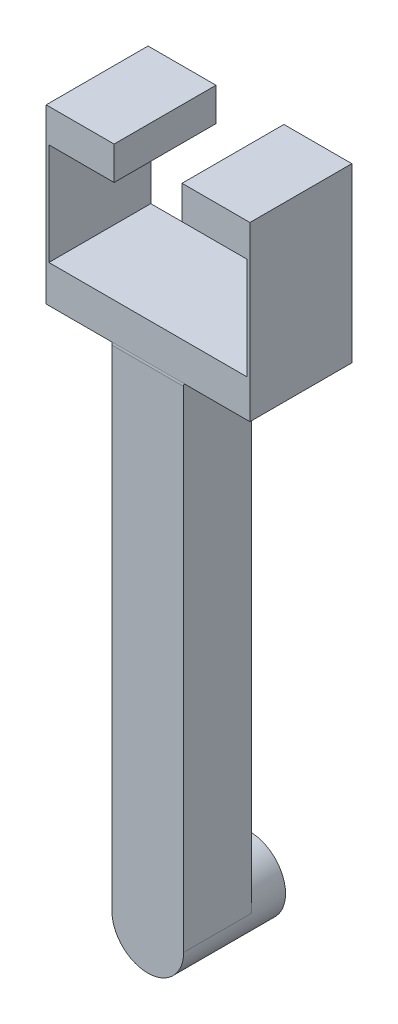
ISO-10303-21;
HEADER;
FILE_DESCRIPTION(('STEP AP214'),'2;1');
FILE_NAME('part.step','',(''),(''),'','','');
FILE_SCHEMA(('AUTOMOTIVE_DESIGN { 1 0 10303 214 1 1 1 1 }'));
ENDSEC;
DATA;
#1=APPLICATION_CONTEXT('core data for automotive mechanical design processes');
#2=APPLICATION_PROTOCOL_DEFINITION('international standard','automotive_design',2000,#1);
#3=PRODUCT_CONTEXT('',#1,'mechanical');
#4=PRODUCT('Part','Part','',(#3));
#5=PRODUCT_RELATED_PRODUCT_CATEGORY('part','',(#4));
#6=PRODUCT_DEFINITION_FORMATION('','',#4);
#7=PRODUCT_DEFINITION_CONTEXT('part definition',#1,'design');
#8=PRODUCT_DEFINITION('design','',#6,#7);
#9=PRODUCT_DEFINITION_SHAPE('','',#8);
#10=(LENGTH_UNIT() NAMED_UNIT(*) SI_UNIT(.MILLI.,.METRE.));
#11=(NAMED_UNIT(*) PLANE_ANGLE_UNIT() SI_UNIT($,.RADIAN.));
#12=(NAMED_UNIT(*) SI_UNIT($,.STERADIAN.) SOLID_ANGLE_UNIT());
#13=UNCERTAINTY_MEASURE_WITH_UNIT(LENGTH_MEASURE(1.E-05),#10,'distance_accuracy_value','');
#14=(GEOMETRIC_REPRESENTATION_CONTEXT(3) GLOBAL_UNCERTAINTY_ASSIGNED_CONTEXT((#13)) GLOBAL_UNIT_ASSIGNED_CONTEXT((#10,
#11,#12)) REPRESENTATION_CONTEXT('',''));
#15=CARTESIAN_POINT('',(0.,0.,0.));
#16=DIRECTION('',(0.,0.,1.));
#17=DIRECTION('',(1.,0.,0.));
#18=AXIS2_PLACEMENT_3D('',#15,#16,#17);
#19=CARTESIAN_POINT('',(0.,0.,38.1));
#20=DIRECTION('',(0.,0.,-1.));
#21=DIRECTION('',(-1.,0.,0.));
#22=AXIS2_PLACEMENT_3D('',#19,#20,#21);
#23=CYLINDRICAL_SURFACE('',#22,13.4112);
#24=CARTESIAN_POINT('',(0.,0.,38.1));
#25=DIRECTION('',(0.,0.,1.));
#26=DIRECTION('',(1.,0.,0.));
#27=AXIS2_PLACEMENT_3D('',#24,#25,#26);
#28=CIRCLE('',#27,13.4112);
#29=CARTESIAN_POINT('',(-13.4112,0.,38.1));
#30=VERTEX_POINT('',#29);
#31=CARTESIAN_POINT('',(13.4112,0.,38.1));
#32=VERTEX_POINT('',#31);
#33=EDGE_CURVE('E353',#30,#32,#28,.T.);
#34=ORIENTED_EDGE('',*,*,#33,.F.);
#35=DIRECTION('',(0.,0.,1.));
#36=VECTOR('',#35,1.);
#37=CARTESIAN_POINT('',(-13.4112,0.,12.7));
#38=LINE('',#37,#36);
#39=CARTESIAN_POINT('',(-13.4112,0.,12.7));
#40=VERTEX_POINT('',#39);
#41=EDGE_CURVE('E334',#40,#30,#38,.T.);
#42=ORIENTED_EDGE('',*,*,#41,.F.);
#43=CARTESIAN_POINT('',(0.,0.,12.7));
#44=DIRECTION('',(0.,0.,-1.));
#45=DIRECTION('',(-1.,0.,0.));
#46=AXIS2_PLACEMENT_3D('',#43,#44,#45);
#47=CIRCLE('',#46,13.4112);
#48=CARTESIAN_POINT('',(13.4112,0.,12.7));
#49=VERTEX_POINT('',#48);
#50=EDGE_CURVE('E356',#40,#49,#47,.T.);
#51=ORIENTED_EDGE('',*,*,#50,.T.);
#52=DIRECTION('',(0.,0.,1.));
#53=VECTOR('',#52,1.);
#54=CARTESIAN_POINT('',(13.4112,0.,12.7));
#55=LINE('',#54,#53);
#56=EDGE_CURVE('E347',#49,#32,#55,.T.);
#57=ORIENTED_EDGE('',*,*,#56,.T.);
#58=EDGE_LOOP('',(#34,#42,#51,#57));
#59=FACE_BOUND('',#58,.T.);
#60=CARTESIAN_POINT('',(0.,0.,0.));
#61=DIRECTION('',(0.,0.,1.));
#62=DIRECTION('',(1.,0.,0.));
#63=AXIS2_PLACEMENT_3D('',#60,#61,#62);
#64=CIRCLE('',#63,13.4112);
#65=CARTESIAN_POINT('',(13.4112,0.,0.));
#66=VERTEX_POINT('',#65);
#67=EDGE_CURVE('E341',#66,#66,#64,.T.);
#68=ORIENTED_EDGE('',*,*,#67,.T.);
#69=EDGE_LOOP('',(#68));
#70=FACE_BOUND('',#69,.T.);
#71=ADVANCED_FACE('F60',(#59,#70),#23,.T.);
#72=CARTESIAN_POINT('',(0.,0.,38.1));
#73=DIRECTION('',(0.,0.,1.));
#74=DIRECTION('',(1.,0.,0.));
#75=AXIS2_PLACEMENT_3D('',#72,#73,#74);
#76=PLANE('',#75);
#77=DIRECTION('',(0.,1.,0.));
#78=VECTOR('',#77,1.);
#79=CARTESIAN_POINT('',(13.4112,0.,38.1));
#80=LINE('',#79,#78);
#81=CARTESIAN_POINT('',(13.4112,183.275219138852,38.1));
#82=VERTEX_POINT('',#81);
#83=EDGE_CURVE('E326',#32,#82,#80,.T.);
#84=ORIENTED_EDGE('',*,*,#83,.T.);
#85=DIRECTION('',(1.,0.,0.));
#86=VECTOR('',#85,1.);
#87=CARTESIAN_POINT('',(-13.4112,183.275219138852,38.1));
#88=LINE('',#87,#86);
#89=CARTESIAN_POINT('',(-13.4112,183.275219138852,38.1));
#90=VERTEX_POINT('',#89);
#91=EDGE_CURVE('E365',#82,#90,#88,.F.);
#92=ORIENTED_EDGE('',*,*,#91,.T.);
#93=DIRECTION('',(0.,-1.,0.));
#94=VECTOR('',#93,1.);
#95=CARTESIAN_POINT('',(-13.4112,0.,38.1));
#96=LINE('',#95,#94);
#97=EDGE_CURVE('E319',#90,#30,#96,.T.);
#98=ORIENTED_EDGE('',*,*,#97,.T.);
#99=ORIENTED_EDGE('',*,*,#33,.T.);
#100=EDGE_LOOP('',(#84,#92,#98,#99));
#101=FACE_BOUND('',#100,.T.);
#102=ADVANCED_FACE('F428',(#101),#76,.T.);
#103=CARTESIAN_POINT('',(0.,0.,0.));
#104=DIRECTION('',(0.,0.,1.));
#105=DIRECTION('',(1.,0.,0.));
#106=AXIS2_PLACEMENT_3D('',#103,#104,#105);
#107=PLANE('',#106);
#108=ORIENTED_EDGE('',*,*,#67,.F.);
#109=EDGE_LOOP('',(#108));
#110=FACE_BOUND('',#109,.T.);
#111=ADVANCED_FACE('F433',(#110),#107,.F.);
#112=CARTESIAN_POINT('',(-13.4112,0.,12.7));
#113=DIRECTION('',(-1.,0.,0.));
#114=DIRECTION('',(0.,0.,1.));
#115=AXIS2_PLACEMENT_3D('',#112,#113,#114);
#116=PLANE('',#115);
#117=ORIENTED_EDGE('',*,*,#97,.F.);
#118=CARTESIAN_POINT('',(-13.4112,183.275219138852,34.29));
#119=DIRECTION('',(-1.,0.,0.));
#120=DIRECTION('',(0.,0.,1.));
#121=AXIS2_PLACEMENT_3D('',#118,#119,#120);
#122=CIRCLE('',#121,3.81);
#123=CARTESIAN_POINT('',(-13.4112,184.15,37.9982149944373));
#124=VERTEX_POINT('',#123);
#125=EDGE_CURVE('E69',#90,#124,#122,.T.);
#126=ORIENTED_EDGE('',*,*,#125,.T.);
#127=DIRECTION('',(0.,0.,1.));
#128=VECTOR('',#127,1.);
#129=CARTESIAN_POINT('',(-13.4112,184.15,12.7));
#130=LINE('',#129,#128);
#131=CARTESIAN_POINT('',(-13.4112,184.15,12.7));
#132=VERTEX_POINT('',#131);
#133=EDGE_CURVE('E338',#132,#124,#130,.T.);
#134=ORIENTED_EDGE('',*,*,#133,.F.);
#135=DIRECTION('',(0.,-1.,0.));
#136=VECTOR('',#135,1.);
#137=CARTESIAN_POINT('',(-13.4112,0.,12.7));
#138=LINE('',#137,#136);
#139=EDGE_CURVE('E321',#132,#40,#138,.T.);
#140=ORIENTED_EDGE('',*,*,#139,.T.);
#141=ORIENTED_EDGE('',*,*,#41,.T.);
#142=EDGE_LOOP('',(#117,#126,#134,#140,#141));
#143=FACE_BOUND('',#142,.T.);
#144=ADVANCED_FACE('F369',(#143),#116,.T.);
#145=CARTESIAN_POINT('',(13.4112,0.,12.7));
#146=DIRECTION('',(1.,0.,0.));
#147=DIRECTION('',(0.,0.,-1.));
#148=AXIS2_PLACEMENT_3D('',#145,#146,#147);
#149=PLANE('',#148);
#150=DIRECTION('',(0.,0.,1.));
#151=VECTOR('',#150,1.);
#152=CARTESIAN_POINT('',(13.4112,184.15,12.7));
#153=LINE('',#152,#151);
#154=CARTESIAN_POINT('',(13.4112,184.15,12.7));
#155=VERTEX_POINT('',#154);
#156=CARTESIAN_POINT('',(13.4112,184.15,37.9982149944373));
#157=VERTEX_POINT('',#156);
#158=EDGE_CURVE('E345',#155,#157,#153,.T.);
#159=ORIENTED_EDGE('',*,*,#158,.T.);
#160=CARTESIAN_POINT('',(13.4112,183.275219138852,34.29));
#161=DIRECTION('',(1.,0.,0.));
#162=DIRECTION('',(0.,0.,-1.));
#163=AXIS2_PLACEMENT_3D('',#160,#161,#162);
#164=CIRCLE('',#163,3.81);
#165=EDGE_CURVE('E13',#157,#82,#164,.T.);
#166=ORIENTED_EDGE('',*,*,#165,.T.);
#167=ORIENTED_EDGE('',*,*,#83,.F.);
#168=ORIENTED_EDGE('',*,*,#56,.F.);
#169=DIRECTION('',(0.,1.,0.));
#170=VECTOR('',#169,1.);
#171=CARTESIAN_POINT('',(13.4112,0.,12.7));
#172=LINE('',#171,#170);
#173=EDGE_CURVE('E324',#49,#155,#172,.T.);
#174=ORIENTED_EDGE('',*,*,#173,.T.);
#175=EDGE_LOOP('',(#159,#166,#167,#168,#174));
#176=FACE_BOUND('',#175,.T.);
#177=ADVANCED_FACE('F441',(#176),#149,.T.);
#178=CARTESIAN_POINT('',(0.,0.,12.7));
#179=DIRECTION('',(0.,0.,-1.));
#180=DIRECTION('',(-1.,0.,0.));
#181=AXIS2_PLACEMENT_3D('',#178,#179,#180);
#182=PLANE('',#181);
#183=ORIENTED_EDGE('',*,*,#50,.F.);
#184=ORIENTED_EDGE('',*,*,#139,.F.);
#185=DIRECTION('',(-1.,0.,0.));
#186=VECTOR('',#185,1.);
#187=CARTESIAN_POINT('',(-13.4112,184.15,12.7));
#188=LINE('',#187,#186);
#189=EDGE_CURVE('E328',#155,#132,#188,.T.);
#190=ORIENTED_EDGE('',*,*,#189,.F.);
#191=ORIENTED_EDGE('',*,*,#173,.F.);
#192=EDGE_LOOP('',(#183,#184,#190,#191));
#193=FACE_BOUND('',#192,.T.);
#194=ADVANCED_FACE('F450',(#193),#182,.T.);
#195=CARTESIAN_POINT('',(38.1,198.12,-0.101785005562682));
#196=DIRECTION('',(-1.,0.,0.));
#197=DIRECTION('',(0.,0.,1.));
#198=AXIS2_PLACEMENT_3D('',#195,#196,#197);
#199=PLANE('',#198);
#200=DIRECTION('',(0.,0.,-1.));
#201=VECTOR('',#200,1.);
#202=CARTESIAN_POINT('',(38.1,184.15,-0.101785005562682));
#203=LINE('',#202,#201);
#204=CARTESIAN_POINT('',(38.1,184.15,37.9982149944373));
#205=VERTEX_POINT('',#204);
#206=CARTESIAN_POINT('',(38.1,184.15,-0.101785005562682));
#207=VERTEX_POINT('',#206);
#208=EDGE_CURVE('E280',#205,#207,#203,.T.);
#209=ORIENTED_EDGE('',*,*,#208,.T.);
#210=DIRECTION('',(0.,-1.,0.));
#211=VECTOR('',#210,1.);
#212=CARTESIAN_POINT('',(38.1,198.12,-0.101785005562682));
#213=LINE('',#212,#211);
#214=CARTESIAN_POINT('',(38.1,248.666,-0.101785005562682));
#215=VERTEX_POINT('',#214);
#216=EDGE_CURVE('E316',#215,#207,#213,.T.);
#217=ORIENTED_EDGE('',*,*,#216,.F.);
#218=DIRECTION('',(0.,0.,-1.));
#219=VECTOR('',#218,1.);
#220=CARTESIAN_POINT('',(38.1,248.666,-0.101785005562682));
#221=LINE('',#220,#219);
#222=CARTESIAN_POINT('',(38.1,248.666,37.9982149944373));
#223=VERTEX_POINT('',#222);
#224=EDGE_CURVE('E243',#223,#215,#221,.T.);
#225=ORIENTED_EDGE('',*,*,#224,.F.);
#226=DIRECTION('',(0.,-1.,0.));
#227=VECTOR('',#226,1.);
#228=CARTESIAN_POINT('',(38.1,198.12,37.9982149944373));
#229=LINE('',#228,#227);
#230=EDGE_CURVE('E188',#223,#205,#229,.T.);
#231=ORIENTED_EDGE('',*,*,#230,.T.);
#232=EDGE_LOOP('',(#209,#217,#225,#231));
#233=FACE_BOUND('',#232,.T.);
#234=ADVANCED_FACE('F382',(#233),#199,.F.);
#235=CARTESIAN_POINT('',(-38.1,198.12,-0.101785005562682));
#236=DIRECTION('',(0.,0.,1.));
#237=DIRECTION('',(1.,0.,0.));
#238=AXIS2_PLACEMENT_3D('',#235,#236,#237);
#239=PLANE('',#238);
#240=DIRECTION('',(-1.,0.,0.));
#241=VECTOR('',#240,1.);
#242=CARTESIAN_POINT('',(-38.1,184.15,-0.101785005562682));
#243=LINE('',#242,#241);
#244=CARTESIAN_POINT('',(-38.1,184.15,-0.101785005562682));
#245=VERTEX_POINT('',#244);
#246=EDGE_CURVE('E301',#207,#245,#243,.T.);
#247=ORIENTED_EDGE('',*,*,#246,.T.);
#248=DIRECTION('',(0.,-1.,0.));
#249=VECTOR('',#248,1.);
#250=CARTESIAN_POINT('',(-38.1,198.12,-0.101785005562682));
#251=LINE('',#250,#249);
#252=CARTESIAN_POINT('',(-38.1,248.666,-0.101785005562682));
#253=VERTEX_POINT('',#252);
#254=EDGE_CURVE('E190',#253,#245,#251,.T.);
#255=ORIENTED_EDGE('',*,*,#254,.F.);
#256=DIRECTION('',(-1.,0.,0.));
#257=VECTOR('',#256,1.);
#258=CARTESIAN_POINT('',(-38.1,248.666,-0.101785005562682));
#259=LINE('',#258,#257);
#260=CARTESIAN_POINT('',(-12.7,248.666,-0.101785005562682));
#261=VERTEX_POINT('',#260);
#262=EDGE_CURVE('E201',#261,#253,#259,.T.);
#263=ORIENTED_EDGE('',*,*,#262,.F.);
#264=DIRECTION('',(0.,-1.,0.));
#265=VECTOR('',#264,1.);
#266=CARTESIAN_POINT('',(-12.7,248.666,-0.101785005562682));
#267=LINE('',#266,#265);
#268=CARTESIAN_POINT('',(-12.7,236.22,-0.101785005562682));
#269=VERTEX_POINT('',#268);
#270=EDGE_CURVE('E216',#261,#269,#267,.T.);
#271=ORIENTED_EDGE('',*,*,#270,.T.);
#272=DIRECTION('',(-1.,0.,0.));
#273=VECTOR('',#272,1.);
#274=CARTESIAN_POINT('',(-38.1,236.22,-0.101785005562682));
#275=LINE('',#274,#273);
#276=CARTESIAN_POINT('',(-37.084,236.22,-0.101785005562682));
#277=VERTEX_POINT('',#276);
#278=EDGE_CURVE('E202',#269,#277,#275,.T.);
#279=ORIENTED_EDGE('',*,*,#278,.T.);
#280=DIRECTION('',(0.,-1.,0.));
#281=VECTOR('',#280,1.);
#282=CARTESIAN_POINT('',(-37.084,236.22,-0.101785005562682));
#283=LINE('',#282,#281);
#284=CARTESIAN_POINT('',(-37.084,198.12,-0.101785005562682));
#285=VERTEX_POINT('',#284);
#286=EDGE_CURVE('E262',#277,#285,#283,.T.);
#287=ORIENTED_EDGE('',*,*,#286,.T.);
#288=DIRECTION('',(-1.,0.,0.));
#289=VECTOR('',#288,1.);
#290=CARTESIAN_POINT('',(-38.1,198.12,-0.101785005562682));
#291=LINE('',#290,#289);
#292=CARTESIAN_POINT('',(37.084,198.12,-0.101785005562682));
#293=VERTEX_POINT('',#292);
#294=EDGE_CURVE('E295',#293,#285,#291,.T.);
#295=ORIENTED_EDGE('',*,*,#294,.F.);
#296=DIRECTION('',(0.,-1.,0.));
#297=VECTOR('',#296,1.);
#298=CARTESIAN_POINT('',(37.084,236.22,-0.101785005562682));
#299=LINE('',#298,#297);
#300=CARTESIAN_POINT('',(37.084,236.22,-0.101785005562682));
#301=VERTEX_POINT('',#300);
#302=EDGE_CURVE('E228',#301,#293,#299,.T.);
#303=ORIENTED_EDGE('',*,*,#302,.F.);
#304=DIRECTION('',(-1.,0.,0.));
#305=VECTOR('',#304,1.);
#306=CARTESIAN_POINT('',(38.1,236.22,-0.101785005562682));
#307=LINE('',#306,#305);
#308=CARTESIAN_POINT('',(12.7,236.22,-0.101785005562679));
#309=VERTEX_POINT('',#308);
#310=EDGE_CURVE('E219',#301,#309,#307,.T.);
#311=ORIENTED_EDGE('',*,*,#310,.T.);
#312=DIRECTION('',(0.,-1.,0.));
#313=VECTOR('',#312,1.);
#314=CARTESIAN_POINT('',(12.7,248.666,-0.101785005562679));
#315=LINE('',#314,#313);
#316=CARTESIAN_POINT('',(12.7,248.666,-0.101785005562679));
#317=VERTEX_POINT('',#316);
#318=EDGE_CURVE('E229',#317,#309,#315,.T.);
#319=ORIENTED_EDGE('',*,*,#318,.F.);
#320=DIRECTION('',(-1.,0.,0.));
#321=VECTOR('',#320,1.);
#322=CARTESIAN_POINT('',(38.1,248.666,-0.101785005562682));
#323=LINE('',#322,#321);
#324=EDGE_CURVE('E255',#215,#317,#323,.T.);
#325=ORIENTED_EDGE('',*,*,#324,.F.);
#326=ORIENTED_EDGE('',*,*,#216,.T.);
#327=EDGE_LOOP('',(#247,#255,#263,#271,#279,#287,#295,#303,#311,#319,#325,#326));
#328=FACE_BOUND('',#327,.T.);
#329=ADVANCED_FACE('F387',(#328),#239,.F.);
#330=CARTESIAN_POINT('',(-38.1,198.12,-0.101785005562682));
#331=DIRECTION('',(1.,0.,0.));
#332=DIRECTION('',(0.,0.,-1.));
#333=AXIS2_PLACEMENT_3D('',#330,#331,#332);
#334=PLANE('',#333);
#335=DIRECTION('',(0.,0.,1.));
#336=VECTOR('',#335,1.);
#337=CARTESIAN_POINT('',(-38.1,184.15,-0.101785005562682));
#338=LINE('',#337,#336);
#339=CARTESIAN_POINT('',(-38.1,184.15,37.9982149944373));
#340=VERTEX_POINT('',#339);
#341=EDGE_CURVE('E185',#245,#340,#338,.T.);
#342=ORIENTED_EDGE('',*,*,#341,.T.);
#343=DIRECTION('',(0.,-1.,0.));
#344=VECTOR('',#343,1.);
#345=CARTESIAN_POINT('',(-38.1,198.12,37.9982149944373));
#346=LINE('',#345,#344);
#347=CARTESIAN_POINT('',(-38.1,248.666,37.9982149944373));
#348=VERTEX_POINT('',#347);
#349=EDGE_CURVE('E171',#348,#340,#346,.T.);
#350=ORIENTED_EDGE('',*,*,#349,.F.);
#351=DIRECTION('',(0.,0.,1.));
#352=VECTOR('',#351,1.);
#353=CARTESIAN_POINT('',(-38.1,248.666,-0.101785005562682));
#354=LINE('',#353,#352);
#355=EDGE_CURVE('E177',#253,#348,#354,.T.);
#356=ORIENTED_EDGE('',*,*,#355,.F.);
#357=ORIENTED_EDGE('',*,*,#254,.T.);
#358=EDGE_LOOP('',(#342,#350,#356,#357));
#359=FACE_BOUND('',#358,.T.);
#360=ADVANCED_FACE('F176',(#359),#334,.F.);
#361=CARTESIAN_POINT('',(-38.1,198.12,37.9982149944373));
#362=DIRECTION('',(0.,0.,-1.));
#363=DIRECTION('',(-1.,0.,0.));
#364=AXIS2_PLACEMENT_3D('',#361,#362,#363);
#365=PLANE('',#364);
#366=DIRECTION('',(1.,0.,0.));
#367=VECTOR('',#366,1.);
#368=CARTESIAN_POINT('',(-38.1,184.15,37.9982149944373));
#369=LINE('',#368,#367);
#370=EDGE_CURVE('E297',#340,#124,#369,.T.);
#371=ORIENTED_EDGE('',*,*,#370,.T.);
#372=EDGE_CURVE('E309',#124,#157,#369,.T.);
#373=ORIENTED_EDGE('',*,*,#372,.T.);
#374=EDGE_CURVE('E307',#157,#205,#369,.T.);
#375=ORIENTED_EDGE('',*,*,#374,.T.);
#376=ORIENTED_EDGE('',*,*,#230,.F.);
#377=DIRECTION('',(1.,0.,0.));
#378=VECTOR('',#377,1.);
#379=CARTESIAN_POINT('',(38.1,248.666,37.9982149944373));
#380=LINE('',#379,#378);
#381=CARTESIAN_POINT('',(12.7,248.666,37.9982149944373));
#382=VERTEX_POINT('',#381);
#383=EDGE_CURVE('E240',#382,#223,#380,.T.);
#384=ORIENTED_EDGE('',*,*,#383,.F.);
#385=DIRECTION('',(0.,-1.,0.));
#386=VECTOR('',#385,1.);
#387=CARTESIAN_POINT('',(12.7,248.666,37.9982149944373));
#388=LINE('',#387,#386);
#389=CARTESIAN_POINT('',(12.7,236.22,37.9982149944373));
#390=VERTEX_POINT('',#389);
#391=EDGE_CURVE('E235',#382,#390,#388,.T.);
#392=ORIENTED_EDGE('',*,*,#391,.T.);
#393=DIRECTION('',(1.,0.,0.));
#394=VECTOR('',#393,1.);
#395=CARTESIAN_POINT('',(38.1,236.22,37.9982149944373));
#396=LINE('',#395,#394);
#397=CARTESIAN_POINT('',(37.084,236.22,37.9982149944373));
#398=VERTEX_POINT('',#397);
#399=EDGE_CURVE('E236',#390,#398,#396,.T.);
#400=ORIENTED_EDGE('',*,*,#399,.T.);
#401=DIRECTION('',(0.,-1.,0.));
#402=VECTOR('',#401,1.);
#403=CARTESIAN_POINT('',(37.084,236.22,37.9982149944373));
#404=LINE('',#403,#402);
#405=CARTESIAN_POINT('',(37.084,198.12,37.9982149944373));
#406=VERTEX_POINT('',#405);
#407=EDGE_CURVE('E282',#398,#406,#404,.T.);
#408=ORIENTED_EDGE('',*,*,#407,.T.);
#409=DIRECTION('',(1.,0.,0.));
#410=VECTOR('',#409,1.);
#411=CARTESIAN_POINT('',(-38.1,198.12,37.9982149944373));
#412=LINE('',#411,#410);
#413=CARTESIAN_POINT('',(-37.084,198.12,37.9982149944373));
#414=VERTEX_POINT('',#413);
#415=EDGE_CURVE('E293',#414,#406,#412,.T.);
#416=ORIENTED_EDGE('',*,*,#415,.F.);
#417=DIRECTION('',(0.,-1.,0.));
#418=VECTOR('',#417,1.);
#419=CARTESIAN_POINT('',(-37.084,236.22,37.9982149944373));
#420=LINE('',#419,#418);
#421=CARTESIAN_POINT('',(-37.084,236.22,37.9982149944373));
#422=VERTEX_POINT('',#421);
#423=EDGE_CURVE('E272',#422,#414,#420,.T.);
#424=ORIENTED_EDGE('',*,*,#423,.F.);
#425=DIRECTION('',(1.,0.,0.));
#426=VECTOR('',#425,1.);
#427=CARTESIAN_POINT('',(-38.1,236.22,37.9982149944373));
#428=LINE('',#427,#426);
#429=CARTESIAN_POINT('',(-12.7,236.22,37.9982149944373));
#430=VERTEX_POINT('',#429);
#431=EDGE_CURVE('E220',#422,#430,#428,.T.);
#432=ORIENTED_EDGE('',*,*,#431,.T.);
#433=DIRECTION('',(0.,-1.,0.));
#434=VECTOR('',#433,1.);
#435=CARTESIAN_POINT('',(-12.7,248.666,37.9982149944373));
#436=LINE('',#435,#434);
#437=CARTESIAN_POINT('',(-12.7,248.666,37.9982149944373));
#438=VERTEX_POINT('',#437);
#439=EDGE_CURVE('E193',#438,#430,#436,.T.);
#440=ORIENTED_EDGE('',*,*,#439,.F.);
#441=DIRECTION('',(1.,0.,0.));
#442=VECTOR('',#441,1.);
#443=CARTESIAN_POINT('',(-38.1,248.666,37.9982149944373));
#444=LINE('',#443,#442);
#445=EDGE_CURVE('E194',#348,#438,#444,.T.);
#446=ORIENTED_EDGE('',*,*,#445,.F.);
#447=ORIENTED_EDGE('',*,*,#349,.T.);
#448=EDGE_LOOP('',(#371,#373,#375,#376,#384,#392,#400,#408,#416,#424,#432,#440,#446,#447));
#449=FACE_BOUND('',#448,.T.);
#450=ADVANCED_FACE('F191',(#449),#365,.F.);
#451=CARTESIAN_POINT('',(0.,198.12,0.));
#452=DIRECTION('',(0.,1.,0.));
#453=DIRECTION('',(0.,0.,1.));
#454=AXIS2_PLACEMENT_3D('',#451,#452,#453);
#455=PLANE('',#454);
#456=DIRECTION('',(0.,0.,-1.));
#457=VECTOR('',#456,1.);
#458=CARTESIAN_POINT('',(-37.084,198.12,-0.101785005562682));
#459=LINE('',#458,#457);
#460=EDGE_CURVE('E264',#414,#285,#459,.T.);
#461=ORIENTED_EDGE('',*,*,#460,.F.);
#462=ORIENTED_EDGE('',*,*,#415,.T.);
#463=DIRECTION('',(0.,0.,1.));
#464=VECTOR('',#463,1.);
#465=CARTESIAN_POINT('',(37.084,198.12,-0.101785005562682));
#466=LINE('',#465,#464);
#467=EDGE_CURVE('E267',#293,#406,#466,.T.);
#468=ORIENTED_EDGE('',*,*,#467,.F.);
#469=ORIENTED_EDGE('',*,*,#294,.T.);
#470=EDGE_LOOP('',(#461,#462,#468,#469));
#471=FACE_BOUND('',#470,.T.);
#472=ADVANCED_FACE('F412',(#471),#455,.T.);
#473=CARTESIAN_POINT('',(0.,184.15,0.));
#474=DIRECTION('',(0.,1.,0.));
#475=DIRECTION('',(0.,0.,1.));
#476=AXIS2_PLACEMENT_3D('',#473,#474,#475);
#477=PLANE('',#476);
#478=ORIENTED_EDGE('',*,*,#158,.F.);
#479=ORIENTED_EDGE('',*,*,#189,.T.);
#480=ORIENTED_EDGE('',*,*,#133,.T.);
#481=ORIENTED_EDGE('',*,*,#370,.F.);
#482=ORIENTED_EDGE('',*,*,#341,.F.);
#483=ORIENTED_EDGE('',*,*,#246,.F.);
#484=ORIENTED_EDGE('',*,*,#208,.F.);
#485=ORIENTED_EDGE('',*,*,#374,.F.);
#486=EDGE_LOOP('',(#478,#479,#480,#481,#482,#483,#484,#485));
#487=FACE_BOUND('',#486,.T.);
#488=ADVANCED_FACE('F373',(#487),#477,.F.);
#489=CARTESIAN_POINT('',(37.084,236.22,-0.101785005562682));
#490=DIRECTION('',(1.,0.,0.));
#491=DIRECTION('',(0.,0.,-1.));
#492=AXIS2_PLACEMENT_3D('',#489,#490,#491);
#493=PLANE('',#492);
#494=ORIENTED_EDGE('',*,*,#467,.T.);
#495=ORIENTED_EDGE('',*,*,#407,.F.);
#496=DIRECTION('',(0.,0.,1.));
#497=VECTOR('',#496,1.);
#498=CARTESIAN_POINT('',(37.084,236.22,-0.101785005562682));
#499=LINE('',#498,#497);
#500=EDGE_CURVE('E281',#301,#398,#499,.T.);
#501=ORIENTED_EDGE('',*,*,#500,.F.);
#502=ORIENTED_EDGE('',*,*,#302,.T.);
#503=EDGE_LOOP('',(#494,#495,#501,#502));
#504=FACE_BOUND('',#503,.T.);
#505=ADVANCED_FACE('F397',(#504),#493,.F.);
#506=CARTESIAN_POINT('',(-37.084,236.22,-0.101785005562682));
#507=DIRECTION('',(-1.,0.,0.));
#508=DIRECTION('',(0.,0.,1.));
#509=AXIS2_PLACEMENT_3D('',#506,#507,#508);
#510=PLANE('',#509);
#511=ORIENTED_EDGE('',*,*,#460,.T.);
#512=ORIENTED_EDGE('',*,*,#286,.F.);
#513=DIRECTION('',(0.,0.,-1.));
#514=VECTOR('',#513,1.);
#515=CARTESIAN_POINT('',(-37.084,236.22,-0.101785005562682));
#516=LINE('',#515,#514);
#517=EDGE_CURVE('E257',#422,#277,#516,.T.);
#518=ORIENTED_EDGE('',*,*,#517,.F.);
#519=ORIENTED_EDGE('',*,*,#423,.T.);
#520=EDGE_LOOP('',(#511,#512,#518,#519));
#521=FACE_BOUND('',#520,.T.);
#522=ADVANCED_FACE('F403',(#521),#510,.F.);
#523=CARTESIAN_POINT('',(0.,236.22,0.));
#524=DIRECTION('',(0.,1.,0.));
#525=DIRECTION('',(0.,0.,1.));
#526=AXIS2_PLACEMENT_3D('',#523,#524,#525);
#527=PLANE('',#526);
#528=ORIENTED_EDGE('',*,*,#431,.F.);
#529=ORIENTED_EDGE('',*,*,#517,.T.);
#530=ORIENTED_EDGE('',*,*,#278,.F.);
#531=DIRECTION('',(0.,0.,-1.));
#532=VECTOR('',#531,1.);
#533=CARTESIAN_POINT('',(-12.7,236.22,-0.101785005562682));
#534=LINE('',#533,#532);
#535=EDGE_CURVE('E207',#430,#269,#534,.T.);
#536=ORIENTED_EDGE('',*,*,#535,.F.);
#537=EDGE_LOOP('',(#528,#529,#530,#536));
#538=FACE_BOUND('',#537,.T.);
#539=ADVANCED_FACE('F406',(#538),#527,.F.);
#540=CARTESIAN_POINT('',(-12.7,248.666,-0.101785005562682));
#541=DIRECTION('',(-1.,0.,0.));
#542=DIRECTION('',(0.,0.,1.));
#543=AXIS2_PLACEMENT_3D('',#540,#541,#542);
#544=PLANE('',#543);
#545=ORIENTED_EDGE('',*,*,#535,.T.);
#546=ORIENTED_EDGE('',*,*,#270,.F.);
#547=DIRECTION('',(0.,0.,-1.));
#548=VECTOR('',#547,1.);
#549=CARTESIAN_POINT('',(-12.7,248.666,-0.101785005562682));
#550=LINE('',#549,#548);
#551=EDGE_CURVE('E196',#438,#261,#550,.T.);
#552=ORIENTED_EDGE('',*,*,#551,.F.);
#553=ORIENTED_EDGE('',*,*,#439,.T.);
#554=EDGE_LOOP('',(#545,#546,#552,#553));
#555=FACE_BOUND('',#554,.T.);
#556=ADVANCED_FACE('F411',(#555),#544,.F.);
#557=CARTESIAN_POINT('',(0.,248.666,0.));
#558=DIRECTION('',(0.,1.,0.));
#559=DIRECTION('',(0.,0.,1.));
#560=AXIS2_PLACEMENT_3D('',#557,#558,#559);
#561=PLANE('',#560);
#562=ORIENTED_EDGE('',*,*,#355,.T.);
#563=ORIENTED_EDGE('',*,*,#445,.T.);
#564=ORIENTED_EDGE('',*,*,#551,.T.);
#565=ORIENTED_EDGE('',*,*,#262,.T.);
#566=EDGE_LOOP('',(#562,#563,#564,#565));
#567=FACE_BOUND('',#566,.T.);
#568=ADVANCED_FACE('F203',(#567),#561,.T.);
#569=CARTESIAN_POINT('',(12.7,248.666,-0.101785005562679));
#570=DIRECTION('',(1.,0.,0.));
#571=DIRECTION('',(0.,0.,-1.));
#572=AXIS2_PLACEMENT_3D('',#569,#570,#571);
#573=PLANE('',#572);
#574=DIRECTION('',(0.,0.,1.));
#575=VECTOR('',#574,1.);
#576=CARTESIAN_POINT('',(12.7,236.22,-0.101785005562679));
#577=LINE('',#576,#575);
#578=EDGE_CURVE('E245',#309,#390,#577,.T.);
#579=ORIENTED_EDGE('',*,*,#578,.T.);
#580=ORIENTED_EDGE('',*,*,#391,.F.);
#581=DIRECTION('',(0.,0.,1.));
#582=VECTOR('',#581,1.);
#583=CARTESIAN_POINT('',(12.7,248.666,-0.101785005562679));
#584=LINE('',#583,#582);
#585=EDGE_CURVE('E253',#317,#382,#584,.T.);
#586=ORIENTED_EDGE('',*,*,#585,.F.);
#587=ORIENTED_EDGE('',*,*,#318,.T.);
#588=EDGE_LOOP('',(#579,#580,#586,#587));
#589=FACE_BOUND('',#588,.T.);
#590=ADVANCED_FACE('F500',(#589),#573,.F.);
#591=CARTESIAN_POINT('',(0.,248.666,0.));
#592=DIRECTION('',(0.,-1.,0.));
#593=DIRECTION('',(0.,0.,-1.));
#594=AXIS2_PLACEMENT_3D('',#591,#592,#593);
#595=PLANE('',#594);
#596=ORIENTED_EDGE('',*,*,#224,.T.);
#597=ORIENTED_EDGE('',*,*,#324,.T.);
#598=ORIENTED_EDGE('',*,*,#585,.T.);
#599=ORIENTED_EDGE('',*,*,#383,.T.);
#600=EDGE_LOOP('',(#596,#597,#598,#599));
#601=FACE_BOUND('',#600,.T.);
#602=ADVANCED_FACE('F388',(#601),#595,.F.);
#603=CARTESIAN_POINT('',(0.,236.22,0.));
#604=DIRECTION('',(0.,-1.,0.));
#605=DIRECTION('',(0.,0.,-1.));
#606=AXIS2_PLACEMENT_3D('',#603,#604,#605);
#607=PLANE('',#606);
#608=ORIENTED_EDGE('',*,*,#310,.F.);
#609=ORIENTED_EDGE('',*,*,#500,.T.);
#610=ORIENTED_EDGE('',*,*,#399,.F.);
#611=ORIENTED_EDGE('',*,*,#578,.F.);
#612=EDGE_LOOP('',(#608,#609,#610,#611));
#613=FACE_BOUND('',#612,.T.);
#614=ADVANCED_FACE('F396',(#613),#607,.T.);
#615=CARTESIAN_POINT('',(-13.4112,183.275219138852,34.29));
#616=DIRECTION('',(-1.,0.,0.));
#617=DIRECTION('',(0.,0.,1.));
#618=AXIS2_PLACEMENT_3D('',#615,#616,#617);
#619=CYLINDRICAL_SURFACE('',#618,3.81);
#620=ORIENTED_EDGE('',*,*,#165,.F.);
#621=ORIENTED_EDGE('',*,*,#372,.F.);
#622=ORIENTED_EDGE('',*,*,#125,.F.);
#623=ORIENTED_EDGE('',*,*,#91,.F.);
#624=EDGE_LOOP('',(#620,#621,#622,#623));
#625=FACE_BOUND('',#624,.T.);
#626=ADVANCED_FACE('F56',(#625),#619,.T.);
#627=CLOSED_SHELL('',(#71,#102,#111,#144,#177,#194,#234,#329,#360,#450,#472,#488,#505,#522,#539,
#556,#568,#590,#602,#614,#626));
#628=MANIFOLD_SOLID_BREP('B2',#627);
#629=ADVANCED_BREP_SHAPE_REPRESENTATION('',(#18,#628),#14);
#630=SHAPE_DEFINITION_REPRESENTATION(#9,#629);
ENDSEC;
END-ISO-10303-21;
